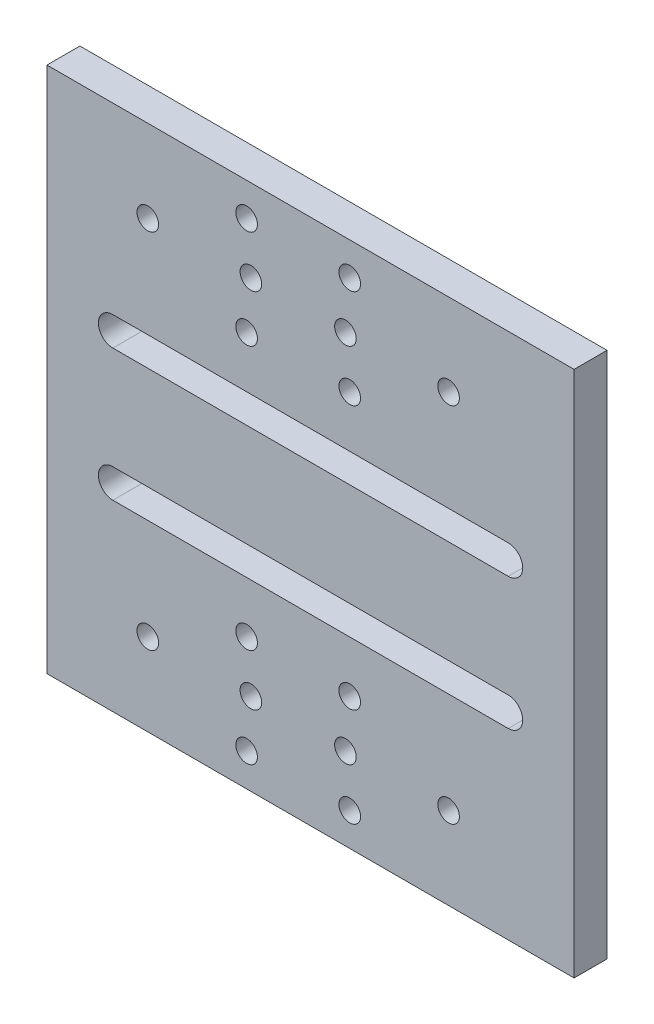
ISO-10303-21;
HEADER;
FILE_DESCRIPTION(('STEP AP214'),'2;1');
FILE_NAME('part.step','',(''),(''),'','','');
FILE_SCHEMA(('AUTOMOTIVE_DESIGN { 1 0 10303 214 1 1 1 1 }'));
ENDSEC;
DATA;
#1=APPLICATION_CONTEXT('core data for automotive mechanical design processes');
#2=APPLICATION_PROTOCOL_DEFINITION('international standard','automotive_design',2000,#1);
#3=PRODUCT_CONTEXT('',#1,'mechanical');
#4=PRODUCT('Part','Part','',(#3));
#5=PRODUCT_RELATED_PRODUCT_CATEGORY('part','',(#4));
#6=PRODUCT_DEFINITION_FORMATION('','',#4);
#7=PRODUCT_DEFINITION_CONTEXT('part definition',#1,'design');
#8=PRODUCT_DEFINITION('design','',#6,#7);
#9=PRODUCT_DEFINITION_SHAPE('','',#8);
#10=(LENGTH_UNIT() NAMED_UNIT(*) SI_UNIT(.MILLI.,.METRE.));
#11=(NAMED_UNIT(*) PLANE_ANGLE_UNIT() SI_UNIT($,.RADIAN.));
#12=(NAMED_UNIT(*) SI_UNIT($,.STERADIAN.) SOLID_ANGLE_UNIT());
#13=UNCERTAINTY_MEASURE_WITH_UNIT(LENGTH_MEASURE(1.E-05),#10,'distance_accuracy_value','');
#14=(GEOMETRIC_REPRESENTATION_CONTEXT(3) GLOBAL_UNCERTAINTY_ASSIGNED_CONTEXT((#13)) GLOBAL_UNIT_ASSIGNED_CONTEXT((#10,
#11,#12)) REPRESENTATION_CONTEXT('',''));
#15=CARTESIAN_POINT('',(0.,0.,0.));
#16=DIRECTION('',(0.,0.,1.));
#17=DIRECTION('',(1.,0.,0.));
#18=AXIS2_PLACEMENT_3D('',#15,#16,#17);
#19=CARTESIAN_POINT('',(0.,101.6,0.));
#20=DIRECTION('',(1.,0.,0.));
#21=DIRECTION('',(0.,0.,-1.));
#22=AXIS2_PLACEMENT_3D('',#19,#20,#21);
#23=PLANE('',#22);
#24=DIRECTION('',(0.,0.,1.));
#25=VECTOR('',#24,1.);
#26=CARTESIAN_POINT('',(0.,0.,0.));
#27=LINE('',#26,#25);
#28=CARTESIAN_POINT('',(0.,0.,-6.35));
#29=VERTEX_POINT('',#28);
#30=CARTESIAN_POINT('',(0.,0.,0.));
#31=VERTEX_POINT('',#30);
#32=EDGE_CURVE('E179',#29,#31,#27,.T.);
#33=ORIENTED_EDGE('',*,*,#32,.T.);
#34=DIRECTION('',(0.,-1.,0.));
#35=VECTOR('',#34,1.);
#36=CARTESIAN_POINT('',(0.,101.6,0.));
#37=LINE('',#36,#35);
#38=CARTESIAN_POINT('',(0.,101.6,0.));
#39=VERTEX_POINT('',#38);
#40=EDGE_CURVE('E11',#39,#31,#37,.T.);
#41=ORIENTED_EDGE('',*,*,#40,.F.);
#42=DIRECTION('',(0.,0.,1.));
#43=VECTOR('',#42,1.);
#44=CARTESIAN_POINT('',(0.,101.6,0.));
#45=LINE('',#44,#43);
#46=CARTESIAN_POINT('',(0.,101.6,-6.35));
#47=VERTEX_POINT('',#46);
#48=EDGE_CURVE('E227',#47,#39,#45,.T.);
#49=ORIENTED_EDGE('',*,*,#48,.F.);
#50=DIRECTION('',(0.,-1.,0.));
#51=VECTOR('',#50,1.);
#52=CARTESIAN_POINT('',(0.,101.6,-6.35));
#53=LINE('',#52,#51);
#54=EDGE_CURVE('E241',#47,#29,#53,.T.);
#55=ORIENTED_EDGE('',*,*,#54,.T.);
#56=EDGE_LOOP('',(#33,#41,#49,#55));
#57=FACE_BOUND('',#56,.T.);
#58=ADVANCED_FACE('F39',(#57),#23,.F.);
#59=CARTESIAN_POINT('',(0.,101.6,0.));
#60=DIRECTION('',(0.,0.,-1.));
#61=DIRECTION('',(-1.,0.,0.));
#62=AXIS2_PLACEMENT_3D('',#59,#60,#61);
#63=PLANE('',#62);
#64=CARTESIAN_POINT('',(77.4065,85.725,0.));
#65=DIRECTION('',(0.,0.,-1.));
#66=DIRECTION('',(-1.,0.,0.));
#67=AXIS2_PLACEMENT_3D('',#64,#65,#66);
#68=CIRCLE('',#67,2.08279999999998);
#69=CARTESIAN_POINT('',(75.3237,85.725,0.));
#70=VERTEX_POINT('',#69);
#71=EDGE_CURVE('E394',#70,#70,#68,.T.);
#72=ORIENTED_EDGE('',*,*,#71,.T.);
#73=EDGE_LOOP('',(#72));
#74=FACE_BOUND('',#73,.T.);
#75=CARTESIAN_POINT('',(58.3565,95.25,0.));
#76=DIRECTION('',(0.,0.,-1.));
#77=DIRECTION('',(-1.,0.,0.));
#78=AXIS2_PLACEMENT_3D('',#75,#76,#77);
#79=CIRCLE('',#78,2.08279999999998);
#80=CARTESIAN_POINT('',(56.2737,95.25,0.));
#81=VERTEX_POINT('',#80);
#82=EDGE_CURVE('E403',#81,#81,#79,.T.);
#83=ORIENTED_EDGE('',*,*,#82,.T.);
#84=EDGE_LOOP('',(#83));
#85=FACE_BOUND('',#84,.T.);
#86=CARTESIAN_POINT('',(58.3565,76.2,0.));
#87=DIRECTION('',(0.,0.,-1.));
#88=DIRECTION('',(-1.,0.,0.));
#89=AXIS2_PLACEMENT_3D('',#86,#87,#88);
#90=CIRCLE('',#89,2.08279999999998);
#91=CARTESIAN_POINT('',(56.2737,76.2,0.));
#92=VERTEX_POINT('',#91);
#93=EDGE_CURVE('E413',#92,#92,#90,.T.);
#94=ORIENTED_EDGE('',*,*,#93,.T.);
#95=EDGE_LOOP('',(#94));
#96=FACE_BOUND('',#95,.T.);
#97=CARTESIAN_POINT('',(39.3065,85.725,0.));
#98=DIRECTION('',(0.,0.,-1.));
#99=DIRECTION('',(-1.,0.,0.));
#100=AXIS2_PLACEMENT_3D('',#97,#98,#99);
#101=CIRCLE('',#100,2.08279999999999);
#102=CARTESIAN_POINT('',(37.2237,85.725,0.));
#103=VERTEX_POINT('',#102);
#104=EDGE_CURVE('E421',#103,#103,#101,.T.);
#105=ORIENTED_EDGE('',*,*,#104,.T.);
#106=EDGE_LOOP('',(#105));
#107=FACE_BOUND('',#106,.T.);
#108=CARTESIAN_POINT('',(77.4065,15.875,0.));
#109=DIRECTION('',(0.,0.,1.));
#110=DIRECTION('',(-1.,0.,0.));
#111=AXIS2_PLACEMENT_3D('',#108,#109,#110);
#112=CIRCLE('',#111,2.08279999999998);
#113=CARTESIAN_POINT('',(75.3237,15.875,0.));
#114=VERTEX_POINT('',#113);
#115=EDGE_CURVE('E430',#114,#114,#112,.T.);
#116=ORIENTED_EDGE('',*,*,#115,.F.);
#117=EDGE_LOOP('',(#116));
#118=FACE_BOUND('',#117,.T.);
#119=CARTESIAN_POINT('',(58.3565,6.34999999999999,0.));
#120=DIRECTION('',(0.,0.,1.));
#121=DIRECTION('',(-1.,0.,0.));
#122=AXIS2_PLACEMENT_3D('',#119,#120,#121);
#123=CIRCLE('',#122,2.08279999999998);
#124=CARTESIAN_POINT('',(56.2737,6.34999999999999,0.));
#125=VERTEX_POINT('',#124);
#126=EDGE_CURVE('E438',#125,#125,#123,.T.);
#127=ORIENTED_EDGE('',*,*,#126,.F.);
#128=EDGE_LOOP('',(#127));
#129=FACE_BOUND('',#128,.T.);
#130=CARTESIAN_POINT('',(58.3565,25.4,0.));
#131=DIRECTION('',(0.,0.,1.));
#132=DIRECTION('',(-1.,0.,0.));
#133=AXIS2_PLACEMENT_3D('',#130,#131,#132);
#134=CIRCLE('',#133,2.08279999999998);
#135=CARTESIAN_POINT('',(56.2737,25.4,0.));
#136=VERTEX_POINT('',#135);
#137=EDGE_CURVE('E446',#136,#136,#134,.T.);
#138=ORIENTED_EDGE('',*,*,#137,.F.);
#139=EDGE_LOOP('',(#138));
#140=FACE_BOUND('',#139,.T.);
#141=CARTESIAN_POINT('',(39.3065,15.875,0.));
#142=DIRECTION('',(0.,0.,1.));
#143=DIRECTION('',(-1.,0.,0.));
#144=AXIS2_PLACEMENT_3D('',#141,#142,#143);
#145=CIRCLE('',#144,2.08279999999999);
#146=CARTESIAN_POINT('',(37.2237,15.875,0.));
#147=VERTEX_POINT('',#146);
#148=EDGE_CURVE('E400',#147,#147,#145,.T.);
#149=ORIENTED_EDGE('',*,*,#148,.F.);
#150=EDGE_LOOP('',(#149));
#151=FACE_BOUND('',#150,.T.);
#152=CARTESIAN_POINT('',(19.431,15.875,0.));
#153=DIRECTION('',(0.,0.,-1.));
#154=DIRECTION('',(1.,0.,0.));
#155=AXIS2_PLACEMENT_3D('',#152,#153,#154);
#156=CIRCLE('',#155,2.08279999999998);
#157=CARTESIAN_POINT('',(21.5138,15.875,0.));
#158=VERTEX_POINT('',#157);
#159=EDGE_CURVE('E461',#158,#158,#156,.T.);
#160=ORIENTED_EDGE('',*,*,#159,.T.);
#161=EDGE_LOOP('',(#160));
#162=FACE_BOUND('',#161,.T.);
#163=CARTESIAN_POINT('',(38.481,6.34999999999999,0.));
#164=DIRECTION('',(0.,0.,-1.));
#165=DIRECTION('',(1.,0.,0.));
#166=AXIS2_PLACEMENT_3D('',#163,#164,#165);
#167=CIRCLE('',#166,2.08279999999998);
#168=CARTESIAN_POINT('',(40.5638,6.34999999999999,0.));
#169=VERTEX_POINT('',#168);
#170=EDGE_CURVE('E469',#169,#169,#167,.T.);
#171=ORIENTED_EDGE('',*,*,#170,.T.);
#172=EDGE_LOOP('',(#171));
#173=FACE_BOUND('',#172,.T.);
#174=CARTESIAN_POINT('',(38.481,25.4,0.));
#175=DIRECTION('',(0.,0.,-1.));
#176=DIRECTION('',(1.,0.,0.));
#177=AXIS2_PLACEMENT_3D('',#174,#175,#176);
#178=CIRCLE('',#177,2.08279999999998);
#179=CARTESIAN_POINT('',(40.5638,25.4,0.));
#180=VERTEX_POINT('',#179);
#181=EDGE_CURVE('E477',#180,#180,#178,.T.);
#182=ORIENTED_EDGE('',*,*,#181,.T.);
#183=EDGE_LOOP('',(#182));
#184=FACE_BOUND('',#183,.T.);
#185=CARTESIAN_POINT('',(57.531,15.875,0.));
#186=DIRECTION('',(0.,0.,-1.));
#187=DIRECTION('',(1.,0.,0.));
#188=AXIS2_PLACEMENT_3D('',#185,#186,#187);
#189=CIRCLE('',#188,2.08279999999999);
#190=CARTESIAN_POINT('',(59.6138,15.875,0.));
#191=VERTEX_POINT('',#190);
#192=EDGE_CURVE('E429',#191,#191,#189,.T.);
#193=ORIENTED_EDGE('',*,*,#192,.T.);
#194=EDGE_LOOP('',(#193));
#195=FACE_BOUND('',#194,.T.);
#196=CARTESIAN_POINT('',(19.431,85.725,0.));
#197=DIRECTION('',(0.,0.,1.));
#198=DIRECTION('',(1.,0.,0.));
#199=AXIS2_PLACEMENT_3D('',#196,#197,#198);
#200=CIRCLE('',#199,2.08279999999998);
#201=CARTESIAN_POINT('',(21.5138,85.725,0.));
#202=VERTEX_POINT('',#201);
#203=EDGE_CURVE('E491',#202,#202,#200,.T.);
#204=ORIENTED_EDGE('',*,*,#203,.F.);
#205=EDGE_LOOP('',(#204));
#206=FACE_BOUND('',#205,.T.);
#207=CARTESIAN_POINT('',(38.481,95.25,0.));
#208=DIRECTION('',(0.,0.,1.));
#209=DIRECTION('',(1.,0.,0.));
#210=AXIS2_PLACEMENT_3D('',#207,#208,#209);
#211=CIRCLE('',#210,2.08279999999998);
#212=CARTESIAN_POINT('',(40.5638,95.25,0.));
#213=VERTEX_POINT('',#212);
#214=EDGE_CURVE('E499',#213,#213,#211,.T.);
#215=ORIENTED_EDGE('',*,*,#214,.F.);
#216=EDGE_LOOP('',(#215));
#217=FACE_BOUND('',#216,.T.);
#218=CARTESIAN_POINT('',(38.481,76.2,0.));
#219=DIRECTION('',(0.,0.,1.));
#220=DIRECTION('',(1.,0.,0.));
#221=AXIS2_PLACEMENT_3D('',#218,#219,#220);
#222=CIRCLE('',#221,2.08279999999998);
#223=CARTESIAN_POINT('',(40.5638,76.2,0.));
#224=VERTEX_POINT('',#223);
#225=EDGE_CURVE('E507',#224,#224,#222,.T.);
#226=ORIENTED_EDGE('',*,*,#225,.F.);
#227=EDGE_LOOP('',(#226));
#228=FACE_BOUND('',#227,.T.);
#229=CARTESIAN_POINT('',(57.531,85.725,0.));
#230=DIRECTION('',(0.,0.,1.));
#231=DIRECTION('',(1.,0.,0.));
#232=AXIS2_PLACEMENT_3D('',#229,#230,#231);
#233=CIRCLE('',#232,2.08279999999999);
#234=CARTESIAN_POINT('',(59.6138,85.725,0.));
#235=VERTEX_POINT('',#234);
#236=EDGE_CURVE('E160',#235,#235,#233,.T.);
#237=ORIENTED_EDGE('',*,*,#236,.F.);
#238=EDGE_LOOP('',(#237));
#239=FACE_BOUND('',#238,.T.);
#240=DIRECTION('',(1.,0.,0.));
#241=VECTOR('',#240,1.);
#242=CARTESIAN_POINT('',(88.9,66.294,0.));
#243=LINE('',#242,#241);
#244=CARTESIAN_POINT('',(12.7,66.294,0.));
#245=VERTEX_POINT('',#244);
#246=CARTESIAN_POINT('',(88.9,66.294,0.));
#247=VERTEX_POINT('',#246);
#248=EDGE_CURVE('E141',#245,#247,#243,.T.);
#249=ORIENTED_EDGE('',*,*,#248,.T.);
#250=CARTESIAN_POINT('',(88.9,63.5,0.));
#251=DIRECTION('',(0.,0.,-1.));
#252=DIRECTION('',(-1.,0.,0.));
#253=AXIS2_PLACEMENT_3D('',#250,#251,#252);
#254=CIRCLE('',#253,2.794);
#255=CARTESIAN_POINT('',(88.9,60.706,0.));
#256=VERTEX_POINT('',#255);
#257=EDGE_CURVE('E132',#247,#256,#254,.T.);
#258=ORIENTED_EDGE('',*,*,#257,.T.);
#259=DIRECTION('',(-1.,0.,0.));
#260=VECTOR('',#259,1.);
#261=CARTESIAN_POINT('',(88.9,60.706,0.));
#262=LINE('',#261,#260);
#263=CARTESIAN_POINT('',(12.7,60.706,0.));
#264=VERTEX_POINT('',#263);
#265=EDGE_CURVE('E144',#256,#264,#262,.T.);
#266=ORIENTED_EDGE('',*,*,#265,.T.);
#267=CARTESIAN_POINT('',(12.7,63.5,0.));
#268=DIRECTION('',(0.,0.,-1.));
#269=DIRECTION('',(1.,0.,0.));
#270=AXIS2_PLACEMENT_3D('',#267,#268,#269);
#271=CIRCLE('',#270,2.794);
#272=EDGE_CURVE('E54',#264,#245,#271,.T.);
#273=ORIENTED_EDGE('',*,*,#272,.T.);
#274=EDGE_LOOP('',(#249,#258,#266,#273));
#275=FACE_BOUND('',#274,.T.);
#276=DIRECTION('',(-1.,0.,0.));
#277=VECTOR('',#276,1.);
#278=CARTESIAN_POINT('',(88.9,35.306,0.));
#279=LINE('',#278,#277);
#280=CARTESIAN_POINT('',(88.9,35.306,0.));
#281=VERTEX_POINT('',#280);
#282=CARTESIAN_POINT('',(12.7,35.306,0.));
#283=VERTEX_POINT('',#282);
#284=EDGE_CURVE('E196',#281,#283,#279,.T.);
#285=ORIENTED_EDGE('',*,*,#284,.T.);
#286=CARTESIAN_POINT('',(12.7,38.1,0.));
#287=DIRECTION('',(0.,0.,-1.));
#288=DIRECTION('',(-1.,0.,0.));
#289=AXIS2_PLACEMENT_3D('',#286,#287,#288);
#290=CIRCLE('',#289,2.794);
#291=CARTESIAN_POINT('',(12.7,40.894,0.));
#292=VERTEX_POINT('',#291);
#293=EDGE_CURVE('E185',#283,#292,#290,.T.);
#294=ORIENTED_EDGE('',*,*,#293,.T.);
#295=DIRECTION('',(1.,0.,0.));
#296=VECTOR('',#295,1.);
#297=CARTESIAN_POINT('',(88.9,40.894,0.));
#298=LINE('',#297,#296);
#299=CARTESIAN_POINT('',(88.9,40.894,0.));
#300=VERTEX_POINT('',#299);
#301=EDGE_CURVE('E189',#292,#300,#298,.T.);
#302=ORIENTED_EDGE('',*,*,#301,.T.);
#303=CARTESIAN_POINT('',(88.9,38.1,0.));
#304=DIRECTION('',(0.,0.,-1.));
#305=DIRECTION('',(1.,0.,0.));
#306=AXIS2_PLACEMENT_3D('',#303,#304,#305);
#307=CIRCLE('',#306,2.794);
#308=EDGE_CURVE('E62',#300,#281,#307,.T.);
#309=ORIENTED_EDGE('',*,*,#308,.T.);
#310=EDGE_LOOP('',(#285,#294,#302,#309));
#311=FACE_BOUND('',#310,.T.);
#312=DIRECTION('',(1.,0.,0.));
#313=VECTOR('',#312,1.);
#314=CARTESIAN_POINT('',(0.,0.,0.));
#315=LINE('',#314,#313);
#316=CARTESIAN_POINT('',(101.6,0.,0.));
#317=VERTEX_POINT('',#316);
#318=EDGE_CURVE('E245',#31,#317,#315,.T.);
#319=ORIENTED_EDGE('',*,*,#318,.T.);
#320=DIRECTION('',(0.,-1.,0.));
#321=VECTOR('',#320,1.);
#322=CARTESIAN_POINT('',(101.6,101.6,0.));
#323=LINE('',#322,#321);
#324=CARTESIAN_POINT('',(101.6,101.6,0.));
#325=VERTEX_POINT('',#324);
#326=EDGE_CURVE('E47',#325,#317,#323,.T.);
#327=ORIENTED_EDGE('',*,*,#326,.F.);
#328=DIRECTION('',(1.,0.,0.));
#329=VECTOR('',#328,1.);
#330=CARTESIAN_POINT('',(0.,101.6,0.));
#331=LINE('',#330,#329);
#332=EDGE_CURVE('E231',#39,#325,#331,.T.);
#333=ORIENTED_EDGE('',*,*,#332,.F.);
#334=ORIENTED_EDGE('',*,*,#40,.T.);
#335=EDGE_LOOP('',(#319,#327,#333,#334));
#336=FACE_BOUND('',#335,.T.);
#337=ADVANCED_FACE('F149',(#74,#85,#96,#107,#118,#129,#140,#151,#162,#173,#184,#195,#206,#217,
#228,#239,#275,#311,#336),#63,.F.);
#338=CARTESIAN_POINT('',(101.6,101.6,0.));
#339=DIRECTION('',(-1.,0.,0.));
#340=DIRECTION('',(0.,0.,1.));
#341=AXIS2_PLACEMENT_3D('',#338,#339,#340);
#342=PLANE('',#341);
#343=DIRECTION('',(0.,0.,-1.));
#344=VECTOR('',#343,1.);
#345=CARTESIAN_POINT('',(101.6,0.,0.));
#346=LINE('',#345,#344);
#347=CARTESIAN_POINT('',(101.6,0.,-6.35));
#348=VERTEX_POINT('',#347);
#349=EDGE_CURVE('E248',#317,#348,#346,.T.);
#350=ORIENTED_EDGE('',*,*,#349,.T.);
#351=DIRECTION('',(0.,-1.,0.));
#352=VECTOR('',#351,1.);
#353=CARTESIAN_POINT('',(101.6,101.6,-6.35));
#354=LINE('',#353,#352);
#355=CARTESIAN_POINT('',(101.6,101.6,-6.35));
#356=VERTEX_POINT('',#355);
#357=EDGE_CURVE('E256',#356,#348,#354,.T.);
#358=ORIENTED_EDGE('',*,*,#357,.F.);
#359=DIRECTION('',(0.,0.,-1.));
#360=VECTOR('',#359,1.);
#361=CARTESIAN_POINT('',(101.6,101.6,0.));
#362=LINE('',#361,#360);
#363=EDGE_CURVE('E235',#325,#356,#362,.T.);
#364=ORIENTED_EDGE('',*,*,#363,.F.);
#365=ORIENTED_EDGE('',*,*,#326,.T.);
#366=EDGE_LOOP('',(#350,#358,#364,#365));
#367=FACE_BOUND('',#366,.T.);
#368=ADVANCED_FACE('F265',(#367),#342,.F.);
#369=CARTESIAN_POINT('',(0.,101.6,-6.35));
#370=DIRECTION('',(0.,0.,1.));
#371=DIRECTION('',(1.,0.,0.));
#372=AXIS2_PLACEMENT_3D('',#369,#370,#371);
#373=PLANE('',#372);
#374=CARTESIAN_POINT('',(77.4065,85.725,-6.35));
#375=DIRECTION('',(0.,0.,-1.));
#376=DIRECTION('',(-1.,0.,0.));
#377=AXIS2_PLACEMENT_3D('',#374,#375,#376);
#378=CIRCLE('',#377,2.08279999999998);
#379=CARTESIAN_POINT('',(75.3237,85.725,-6.35));
#380=VERTEX_POINT('',#379);
#381=EDGE_CURVE('E392',#380,#380,#378,.T.);
#382=ORIENTED_EDGE('',*,*,#381,.F.);
#383=EDGE_LOOP('',(#382));
#384=FACE_BOUND('',#383,.T.);
#385=CARTESIAN_POINT('',(58.3565,95.25,-6.35));
#386=DIRECTION('',(0.,0.,-1.));
#387=DIRECTION('',(-1.,0.,0.));
#388=AXIS2_PLACEMENT_3D('',#385,#386,#387);
#389=CIRCLE('',#388,2.08279999999998);
#390=CARTESIAN_POINT('',(56.2737,95.25,-6.35));
#391=VERTEX_POINT('',#390);
#392=EDGE_CURVE('E396',#391,#391,#389,.T.);
#393=ORIENTED_EDGE('',*,*,#392,.F.);
#394=EDGE_LOOP('',(#393));
#395=FACE_BOUND('',#394,.T.);
#396=CARTESIAN_POINT('',(58.3565,76.2,-6.35));
#397=DIRECTION('',(0.,0.,-1.));
#398=DIRECTION('',(-1.,0.,0.));
#399=AXIS2_PLACEMENT_3D('',#396,#397,#398);
#400=CIRCLE('',#399,2.08279999999998);
#401=CARTESIAN_POINT('',(56.2737,76.2,-6.35));
#402=VERTEX_POINT('',#401);
#403=EDGE_CURVE('E409',#402,#402,#400,.T.);
#404=ORIENTED_EDGE('',*,*,#403,.F.);
#405=EDGE_LOOP('',(#404));
#406=FACE_BOUND('',#405,.T.);
#407=CARTESIAN_POINT('',(39.3065,85.725,-6.35));
#408=DIRECTION('',(0.,0.,-1.));
#409=DIRECTION('',(-1.,0.,0.));
#410=AXIS2_PLACEMENT_3D('',#407,#408,#409);
#411=CIRCLE('',#410,2.08279999999999);
#412=CARTESIAN_POINT('',(37.2237,85.725,-6.35));
#413=VERTEX_POINT('',#412);
#414=EDGE_CURVE('E417',#413,#413,#411,.T.);
#415=ORIENTED_EDGE('',*,*,#414,.F.);
#416=EDGE_LOOP('',(#415));
#417=FACE_BOUND('',#416,.T.);
#418=CARTESIAN_POINT('',(77.4065,15.875,-6.35));
#419=DIRECTION('',(0.,0.,1.));
#420=DIRECTION('',(-1.,0.,0.));
#421=AXIS2_PLACEMENT_3D('',#418,#419,#420);
#422=CIRCLE('',#421,2.08279999999998);
#423=CARTESIAN_POINT('',(75.3237,15.875,-6.35));
#424=VERTEX_POINT('',#423);
#425=EDGE_CURVE('E425',#424,#424,#422,.T.);
#426=ORIENTED_EDGE('',*,*,#425,.T.);
#427=EDGE_LOOP('',(#426));
#428=FACE_BOUND('',#427,.T.);
#429=CARTESIAN_POINT('',(58.3565,6.34999999999999,-6.35));
#430=DIRECTION('',(0.,0.,1.));
#431=DIRECTION('',(-1.,0.,0.));
#432=AXIS2_PLACEMENT_3D('',#429,#430,#431);
#433=CIRCLE('',#432,2.08279999999998);
#434=CARTESIAN_POINT('',(56.2737,6.34999999999999,-6.35));
#435=VERTEX_POINT('',#434);
#436=EDGE_CURVE('E434',#435,#435,#433,.T.);
#437=ORIENTED_EDGE('',*,*,#436,.T.);
#438=EDGE_LOOP('',(#437));
#439=FACE_BOUND('',#438,.T.);
#440=CARTESIAN_POINT('',(58.3565,25.4,-6.35));
#441=DIRECTION('',(0.,0.,1.));
#442=DIRECTION('',(-1.,0.,0.));
#443=AXIS2_PLACEMENT_3D('',#440,#441,#442);
#444=CIRCLE('',#443,2.08279999999998);
#445=CARTESIAN_POINT('',(56.2737,25.4,-6.35));
#446=VERTEX_POINT('',#445);
#447=EDGE_CURVE('E442',#446,#446,#444,.T.);
#448=ORIENTED_EDGE('',*,*,#447,.T.);
#449=EDGE_LOOP('',(#448));
#450=FACE_BOUND('',#449,.T.);
#451=CARTESIAN_POINT('',(39.3065,15.875,-6.35));
#452=DIRECTION('',(0.,0.,1.));
#453=DIRECTION('',(-1.,0.,0.));
#454=AXIS2_PLACEMENT_3D('',#451,#452,#453);
#455=CIRCLE('',#454,2.08279999999999);
#456=CARTESIAN_POINT('',(37.2237,15.875,-6.35));
#457=VERTEX_POINT('',#456);
#458=EDGE_CURVE('E450',#457,#457,#455,.T.);
#459=ORIENTED_EDGE('',*,*,#458,.T.);
#460=EDGE_LOOP('',(#459));
#461=FACE_BOUND('',#460,.T.);
#462=CARTESIAN_POINT('',(19.431,15.875,-6.35));
#463=DIRECTION('',(0.,0.,-1.));
#464=DIRECTION('',(1.,0.,0.));
#465=AXIS2_PLACEMENT_3D('',#462,#463,#464);
#466=CIRCLE('',#465,2.08279999999998);
#467=CARTESIAN_POINT('',(21.5138,15.875,-6.35));
#468=VERTEX_POINT('',#467);
#469=EDGE_CURVE('E457',#468,#468,#466,.T.);
#470=ORIENTED_EDGE('',*,*,#469,.F.);
#471=EDGE_LOOP('',(#470));
#472=FACE_BOUND('',#471,.T.);
#473=CARTESIAN_POINT('',(38.481,6.34999999999999,-6.35));
#474=DIRECTION('',(0.,0.,-1.));
#475=DIRECTION('',(1.,0.,0.));
#476=AXIS2_PLACEMENT_3D('',#473,#474,#475);
#477=CIRCLE('',#476,2.08279999999998);
#478=CARTESIAN_POINT('',(40.5638,6.34999999999999,-6.35));
#479=VERTEX_POINT('',#478);
#480=EDGE_CURVE('E465',#479,#479,#477,.T.);
#481=ORIENTED_EDGE('',*,*,#480,.F.);
#482=EDGE_LOOP('',(#481));
#483=FACE_BOUND('',#482,.T.);
#484=CARTESIAN_POINT('',(38.481,25.4,-6.35));
#485=DIRECTION('',(0.,0.,-1.));
#486=DIRECTION('',(1.,0.,0.));
#487=AXIS2_PLACEMENT_3D('',#484,#485,#486);
#488=CIRCLE('',#487,2.08279999999998);
#489=CARTESIAN_POINT('',(40.5638,25.4,-6.35));
#490=VERTEX_POINT('',#489);
#491=EDGE_CURVE('E473',#490,#490,#488,.T.);
#492=ORIENTED_EDGE('',*,*,#491,.F.);
#493=EDGE_LOOP('',(#492));
#494=FACE_BOUND('',#493,.T.);
#495=CARTESIAN_POINT('',(57.531,15.875,-6.35));
#496=DIRECTION('',(0.,0.,-1.));
#497=DIRECTION('',(1.,0.,0.));
#498=AXIS2_PLACEMENT_3D('',#495,#496,#497);
#499=CIRCLE('',#498,2.08279999999999);
#500=CARTESIAN_POINT('',(59.6138,15.875,-6.35));
#501=VERTEX_POINT('',#500);
#502=EDGE_CURVE('E481',#501,#501,#499,.T.);
#503=ORIENTED_EDGE('',*,*,#502,.F.);
#504=EDGE_LOOP('',(#503));
#505=FACE_BOUND('',#504,.T.);
#506=CARTESIAN_POINT('',(19.431,85.725,-6.35));
#507=DIRECTION('',(0.,0.,1.));
#508=DIRECTION('',(1.,0.,0.));
#509=AXIS2_PLACEMENT_3D('',#506,#507,#508);
#510=CIRCLE('',#509,2.08279999999998);
#511=CARTESIAN_POINT('',(21.5138,85.725,-6.35));
#512=VERTEX_POINT('',#511);
#513=EDGE_CURVE('E205',#512,#512,#510,.T.);
#514=ORIENTED_EDGE('',*,*,#513,.T.);
#515=EDGE_LOOP('',(#514));
#516=FACE_BOUND('',#515,.T.);
#517=CARTESIAN_POINT('',(38.481,95.25,-6.35));
#518=DIRECTION('',(0.,0.,1.));
#519=DIRECTION('',(1.,0.,0.));
#520=AXIS2_PLACEMENT_3D('',#517,#518,#519);
#521=CIRCLE('',#520,2.08279999999998);
#522=CARTESIAN_POINT('',(40.5638,95.25,-6.35));
#523=VERTEX_POINT('',#522);
#524=EDGE_CURVE('E495',#523,#523,#521,.T.);
#525=ORIENTED_EDGE('',*,*,#524,.T.);
#526=EDGE_LOOP('',(#525));
#527=FACE_BOUND('',#526,.T.);
#528=CARTESIAN_POINT('',(38.481,76.2,-6.35));
#529=DIRECTION('',(0.,0.,1.));
#530=DIRECTION('',(1.,0.,0.));
#531=AXIS2_PLACEMENT_3D('',#528,#529,#530);
#532=CIRCLE('',#531,2.08279999999998);
#533=CARTESIAN_POINT('',(40.5638,76.2,-6.35));
#534=VERTEX_POINT('',#533);
#535=EDGE_CURVE('E503',#534,#534,#532,.T.);
#536=ORIENTED_EDGE('',*,*,#535,.T.);
#537=EDGE_LOOP('',(#536));
#538=FACE_BOUND('',#537,.T.);
#539=CARTESIAN_POINT('',(57.531,85.725,-6.35));
#540=DIRECTION('',(0.,0.,1.));
#541=DIRECTION('',(1.,0.,0.));
#542=AXIS2_PLACEMENT_3D('',#539,#540,#541);
#543=CIRCLE('',#542,2.08279999999999);
#544=CARTESIAN_POINT('',(59.6138,85.725,-6.35));
#545=VERTEX_POINT('',#544);
#546=EDGE_CURVE('E510',#545,#545,#543,.T.);
#547=ORIENTED_EDGE('',*,*,#546,.T.);
#548=EDGE_LOOP('',(#547));
#549=FACE_BOUND('',#548,.T.);
#550=DIRECTION('',(-1.,0.,0.));
#551=VECTOR('',#550,1.);
#552=CARTESIAN_POINT('',(88.9,60.706,-6.35));
#553=LINE('',#552,#551);
#554=CARTESIAN_POINT('',(88.9,60.706,-6.35));
#555=VERTEX_POINT('',#554);
#556=CARTESIAN_POINT('',(12.7,60.706,-6.35));
#557=VERTEX_POINT('',#556);
#558=EDGE_CURVE('E169',#555,#557,#553,.T.);
#559=ORIENTED_EDGE('',*,*,#558,.F.);
#560=CARTESIAN_POINT('',(88.9,63.5,-6.35));
#561=DIRECTION('',(0.,0.,-1.));
#562=DIRECTION('',(-1.,0.,0.));
#563=AXIS2_PLACEMENT_3D('',#560,#561,#562);
#564=CIRCLE('',#563,2.794);
#565=CARTESIAN_POINT('',(88.9,66.294,-6.35));
#566=VERTEX_POINT('',#565);
#567=EDGE_CURVE('E135',#566,#555,#564,.T.);
#568=ORIENTED_EDGE('',*,*,#567,.F.);
#569=DIRECTION('',(1.,0.,0.));
#570=VECTOR('',#569,1.);
#571=CARTESIAN_POINT('',(88.9,66.294,-6.35));
#572=LINE('',#571,#570);
#573=CARTESIAN_POINT('',(12.7,66.294,-6.35));
#574=VERTEX_POINT('',#573);
#575=EDGE_CURVE('E153',#574,#566,#572,.T.);
#576=ORIENTED_EDGE('',*,*,#575,.F.);
#577=CARTESIAN_POINT('',(12.7,63.5,-6.35));
#578=DIRECTION('',(0.,0.,-1.));
#579=DIRECTION('',(1.,0.,0.));
#580=AXIS2_PLACEMENT_3D('',#577,#578,#579);
#581=CIRCLE('',#580,2.794);
#582=EDGE_CURVE('E157',#557,#574,#581,.T.);
#583=ORIENTED_EDGE('',*,*,#582,.F.);
#584=EDGE_LOOP('',(#559,#568,#576,#583));
#585=FACE_BOUND('',#584,.T.);
#586=DIRECTION('',(1.,0.,0.));
#587=VECTOR('',#586,1.);
#588=CARTESIAN_POINT('',(88.9,40.894,-6.35));
#589=LINE('',#588,#587);
#590=CARTESIAN_POINT('',(12.7,40.894,-6.35));
#591=VERTEX_POINT('',#590);
#592=CARTESIAN_POINT('',(88.9,40.894,-6.35));
#593=VERTEX_POINT('',#592);
#594=EDGE_CURVE('E204',#591,#593,#589,.T.);
#595=ORIENTED_EDGE('',*,*,#594,.F.);
#596=CARTESIAN_POINT('',(12.7,38.1,-6.35));
#597=DIRECTION('',(0.,0.,-1.));
#598=DIRECTION('',(-1.,0.,0.));
#599=AXIS2_PLACEMENT_3D('',#596,#597,#598);
#600=CIRCLE('',#599,2.794);
#601=CARTESIAN_POINT('',(12.7,35.306,-6.35));
#602=VERTEX_POINT('',#601);
#603=EDGE_CURVE('E201',#602,#591,#600,.T.);
#604=ORIENTED_EDGE('',*,*,#603,.F.);
#605=DIRECTION('',(-1.,0.,0.));
#606=VECTOR('',#605,1.);
#607=CARTESIAN_POINT('',(88.9,35.306,-6.35));
#608=LINE('',#607,#606);
#609=CARTESIAN_POINT('',(88.9,35.306,-6.35));
#610=VERTEX_POINT('',#609);
#611=EDGE_CURVE('E190',#610,#602,#608,.T.);
#612=ORIENTED_EDGE('',*,*,#611,.F.);
#613=CARTESIAN_POINT('',(88.9,38.1,-6.35));
#614=DIRECTION('',(0.,0.,-1.));
#615=DIRECTION('',(1.,0.,0.));
#616=AXIS2_PLACEMENT_3D('',#613,#614,#615);
#617=CIRCLE('',#616,2.794);
#618=EDGE_CURVE('E209',#593,#610,#617,.T.);
#619=ORIENTED_EDGE('',*,*,#618,.F.);
#620=EDGE_LOOP('',(#595,#604,#612,#619));
#621=FACE_BOUND('',#620,.T.);
#622=DIRECTION('',(-1.,0.,0.));
#623=VECTOR('',#622,1.);
#624=CARTESIAN_POINT('',(0.,0.,-6.35));
#625=LINE('',#624,#623);
#626=EDGE_CURVE('E232',#348,#29,#625,.T.);
#627=ORIENTED_EDGE('',*,*,#626,.T.);
#628=ORIENTED_EDGE('',*,*,#54,.F.);
#629=DIRECTION('',(-1.,0.,0.));
#630=VECTOR('',#629,1.);
#631=CARTESIAN_POINT('',(0.,101.6,-6.35));
#632=LINE('',#631,#630);
#633=EDGE_CURVE('E238',#356,#47,#632,.T.);
#634=ORIENTED_EDGE('',*,*,#633,.F.);
#635=ORIENTED_EDGE('',*,*,#357,.T.);
#636=EDGE_LOOP('',(#627,#628,#634,#635));
#637=FACE_BOUND('',#636,.T.);
#638=ADVANCED_FACE('F274',(#384,#395,#406,#417,#428,#439,#450,#461,#472,#483,#494,#505,#516,
#527,#538,#549,#585,#621,#637),#373,.F.);
#639=CARTESIAN_POINT('',(0.,101.6,0.));
#640=DIRECTION('',(0.,-1.,0.));
#641=DIRECTION('',(0.,0.,-1.));
#642=AXIS2_PLACEMENT_3D('',#639,#640,#641);
#643=PLANE('',#642);
#644=ORIENTED_EDGE('',*,*,#48,.T.);
#645=ORIENTED_EDGE('',*,*,#332,.T.);
#646=ORIENTED_EDGE('',*,*,#363,.T.);
#647=ORIENTED_EDGE('',*,*,#633,.T.);
#648=EDGE_LOOP('',(#644,#645,#646,#647));
#649=FACE_BOUND('',#648,.T.);
#650=ADVANCED_FACE('F280',(#649),#643,.F.);
#651=CARTESIAN_POINT('',(0.,0.,0.));
#652=DIRECTION('',(0.,-1.,0.));
#653=DIRECTION('',(0.,0.,-1.));
#654=AXIS2_PLACEMENT_3D('',#651,#652,#653);
#655=PLANE('',#654);
#656=ORIENTED_EDGE('',*,*,#32,.F.);
#657=ORIENTED_EDGE('',*,*,#626,.F.);
#658=ORIENTED_EDGE('',*,*,#349,.F.);
#659=ORIENTED_EDGE('',*,*,#318,.F.);
#660=EDGE_LOOP('',(#656,#657,#658,#659));
#661=FACE_BOUND('',#660,.T.);
#662=ADVANCED_FACE('F271',(#661),#655,.T.);
#663=CARTESIAN_POINT('',(12.7,38.1,0.));
#664=DIRECTION('',(0.,0.,-1.));
#665=DIRECTION('',(-1.,0.,0.));
#666=AXIS2_PLACEMENT_3D('',#663,#664,#665);
#667=CYLINDRICAL_SURFACE('',#666,2.794);
#668=ORIENTED_EDGE('',*,*,#603,.T.);
#669=DIRECTION('',(0.,0.,-1.));
#670=VECTOR('',#669,1.);
#671=CARTESIAN_POINT('',(12.7,40.894,0.));
#672=LINE('',#671,#670);
#673=EDGE_CURVE('E200',#292,#591,#672,.T.);
#674=ORIENTED_EDGE('',*,*,#673,.F.);
#675=ORIENTED_EDGE('',*,*,#293,.F.);
#676=DIRECTION('',(0.,0.,-1.));
#677=VECTOR('',#676,1.);
#678=CARTESIAN_POINT('',(12.7,35.306,0.));
#679=LINE('',#678,#677);
#680=EDGE_CURVE('E170',#283,#602,#679,.T.);
#681=ORIENTED_EDGE('',*,*,#680,.T.);
#682=EDGE_LOOP('',(#668,#674,#675,#681));
#683=FACE_BOUND('',#682,.T.);
#684=ADVANCED_FACE('F296',(#683),#667,.F.);
#685=CARTESIAN_POINT('',(88.9,35.306,0.));
#686=DIRECTION('',(0.,-1.,0.));
#687=DIRECTION('',(0.,0.,-1.));
#688=AXIS2_PLACEMENT_3D('',#685,#686,#687);
#689=PLANE('',#688);
#690=ORIENTED_EDGE('',*,*,#611,.T.);
#691=ORIENTED_EDGE('',*,*,#680,.F.);
#692=ORIENTED_EDGE('',*,*,#284,.F.);
#693=DIRECTION('',(0.,0.,-1.));
#694=VECTOR('',#693,1.);
#695=CARTESIAN_POINT('',(88.9,35.306,0.));
#696=LINE('',#695,#694);
#697=EDGE_CURVE('E218',#281,#610,#696,.T.);
#698=ORIENTED_EDGE('',*,*,#697,.T.);
#699=EDGE_LOOP('',(#690,#691,#692,#698));
#700=FACE_BOUND('',#699,.T.);
#701=ADVANCED_FACE('F301',(#700),#689,.F.);
#702=CARTESIAN_POINT('',(88.9,38.1,0.));
#703=DIRECTION('',(0.,0.,-1.));
#704=DIRECTION('',(-1.,0.,0.));
#705=AXIS2_PLACEMENT_3D('',#702,#703,#704);
#706=CYLINDRICAL_SURFACE('',#705,2.794);
#707=ORIENTED_EDGE('',*,*,#618,.T.);
#708=ORIENTED_EDGE('',*,*,#697,.F.);
#709=ORIENTED_EDGE('',*,*,#308,.F.);
#710=DIRECTION('',(0.,0.,-1.));
#711=VECTOR('',#710,1.);
#712=CARTESIAN_POINT('',(88.9,40.894,0.));
#713=LINE('',#712,#711);
#714=EDGE_CURVE('E221',#300,#593,#713,.T.);
#715=ORIENTED_EDGE('',*,*,#714,.T.);
#716=EDGE_LOOP('',(#707,#708,#709,#715));
#717=FACE_BOUND('',#716,.T.);
#718=ADVANCED_FACE('F306',(#717),#706,.F.);
#719=CARTESIAN_POINT('',(88.9,40.894,0.));
#720=DIRECTION('',(0.,1.,0.));
#721=DIRECTION('',(0.,0.,1.));
#722=AXIS2_PLACEMENT_3D('',#719,#720,#721);
#723=PLANE('',#722);
#724=ORIENTED_EDGE('',*,*,#594,.T.);
#725=ORIENTED_EDGE('',*,*,#714,.F.);
#726=ORIENTED_EDGE('',*,*,#301,.F.);
#727=ORIENTED_EDGE('',*,*,#673,.T.);
#728=EDGE_LOOP('',(#724,#725,#726,#727));
#729=FACE_BOUND('',#728,.T.);
#730=ADVANCED_FACE('F303',(#729),#723,.F.);
#731=CARTESIAN_POINT('',(88.9,63.5,0.));
#732=DIRECTION('',(0.,0.,-1.));
#733=DIRECTION('',(-1.,0.,0.));
#734=AXIS2_PLACEMENT_3D('',#731,#732,#733);
#735=CYLINDRICAL_SURFACE('',#734,2.794);
#736=ORIENTED_EDGE('',*,*,#567,.T.);
#737=DIRECTION('',(0.,0.,-1.));
#738=VECTOR('',#737,1.);
#739=CARTESIAN_POINT('',(88.9,60.706,0.));
#740=LINE('',#739,#738);
#741=EDGE_CURVE('E128',#256,#555,#740,.T.);
#742=ORIENTED_EDGE('',*,*,#741,.F.);
#743=ORIENTED_EDGE('',*,*,#257,.F.);
#744=DIRECTION('',(0.,0.,-1.));
#745=VECTOR('',#744,1.);
#746=CARTESIAN_POINT('',(88.9,66.294,0.));
#747=LINE('',#746,#745);
#748=EDGE_CURVE('E176',#247,#566,#747,.T.);
#749=ORIENTED_EDGE('',*,*,#748,.T.);
#750=EDGE_LOOP('',(#736,#742,#743,#749));
#751=FACE_BOUND('',#750,.T.);
#752=ADVANCED_FACE('F130',(#751),#735,.F.);
#753=CARTESIAN_POINT('',(88.9,66.294,0.));
#754=DIRECTION('',(0.,1.,0.));
#755=DIRECTION('',(0.,0.,1.));
#756=AXIS2_PLACEMENT_3D('',#753,#754,#755);
#757=PLANE('',#756);
#758=ORIENTED_EDGE('',*,*,#575,.T.);
#759=ORIENTED_EDGE('',*,*,#748,.F.);
#760=ORIENTED_EDGE('',*,*,#248,.F.);
#761=DIRECTION('',(0.,0.,-1.));
#762=VECTOR('',#761,1.);
#763=CARTESIAN_POINT('',(12.7,66.294,0.));
#764=LINE('',#763,#762);
#765=EDGE_CURVE('E180',#245,#574,#764,.T.);
#766=ORIENTED_EDGE('',*,*,#765,.T.);
#767=EDGE_LOOP('',(#758,#759,#760,#766));
#768=FACE_BOUND('',#767,.T.);
#769=ADVANCED_FACE('F315',(#768),#757,.F.);
#770=CARTESIAN_POINT('',(12.7,63.5,0.));
#771=DIRECTION('',(0.,0.,-1.));
#772=DIRECTION('',(-1.,0.,0.));
#773=AXIS2_PLACEMENT_3D('',#770,#771,#772);
#774=CYLINDRICAL_SURFACE('',#773,2.794);
#775=ORIENTED_EDGE('',*,*,#582,.T.);
#776=ORIENTED_EDGE('',*,*,#765,.F.);
#777=ORIENTED_EDGE('',*,*,#272,.F.);
#778=DIRECTION('',(0.,0.,-1.));
#779=VECTOR('',#778,1.);
#780=CARTESIAN_POINT('',(12.7,60.706,0.));
#781=LINE('',#780,#779);
#782=EDGE_CURVE('E140',#264,#557,#781,.T.);
#783=ORIENTED_EDGE('',*,*,#782,.T.);
#784=EDGE_LOOP('',(#775,#776,#777,#783));
#785=FACE_BOUND('',#784,.T.);
#786=ADVANCED_FACE('F319',(#785),#774,.F.);
#787=CARTESIAN_POINT('',(88.9,60.706,0.));
#788=DIRECTION('',(0.,-1.,0.));
#789=DIRECTION('',(0.,0.,-1.));
#790=AXIS2_PLACEMENT_3D('',#787,#788,#789);
#791=PLANE('',#790);
#792=ORIENTED_EDGE('',*,*,#558,.T.);
#793=ORIENTED_EDGE('',*,*,#782,.F.);
#794=ORIENTED_EDGE('',*,*,#265,.F.);
#795=ORIENTED_EDGE('',*,*,#741,.T.);
#796=EDGE_LOOP('',(#792,#793,#794,#795));
#797=FACE_BOUND('',#796,.T.);
#798=ADVANCED_FACE('F145',(#797),#791,.F.);
#799=CARTESIAN_POINT('',(57.531,85.725,-6.35));
#800=DIRECTION('',(0.,0.,1.));
#801=DIRECTION('',(1.,0.,0.));
#802=AXIS2_PLACEMENT_3D('',#799,#800,#801);
#803=CYLINDRICAL_SURFACE('',#802,2.08279999999999);
#804=ORIENTED_EDGE('',*,*,#546,.F.);
#805=EDGE_LOOP('',(#804));
#806=FACE_BOUND('',#805,.T.);
#807=ORIENTED_EDGE('',*,*,#236,.T.);
#808=EDGE_LOOP('',(#807));
#809=FACE_BOUND('',#808,.T.);
#810=ADVANCED_FACE('F318',(#806,#809),#803,.F.);
#811=CARTESIAN_POINT('',(38.481,76.2,-6.35));
#812=DIRECTION('',(0.,0.,1.));
#813=DIRECTION('',(1.,0.,0.));
#814=AXIS2_PLACEMENT_3D('',#811,#812,#813);
#815=CYLINDRICAL_SURFACE('',#814,2.08279999999998);
#816=ORIENTED_EDGE('',*,*,#535,.F.);
#817=EDGE_LOOP('',(#816));
#818=FACE_BOUND('',#817,.T.);
#819=ORIENTED_EDGE('',*,*,#225,.T.);
#820=EDGE_LOOP('',(#819));
#821=FACE_BOUND('',#820,.T.);
#822=ADVANCED_FACE('F327',(#818,#821),#815,.F.);
#823=CARTESIAN_POINT('',(38.481,95.25,-6.35));
#824=DIRECTION('',(0.,0.,1.));
#825=DIRECTION('',(1.,0.,0.));
#826=AXIS2_PLACEMENT_3D('',#823,#824,#825);
#827=CYLINDRICAL_SURFACE('',#826,2.08279999999998);
#828=ORIENTED_EDGE('',*,*,#524,.F.);
#829=EDGE_LOOP('',(#828));
#830=FACE_BOUND('',#829,.T.);
#831=ORIENTED_EDGE('',*,*,#214,.T.);
#832=EDGE_LOOP('',(#831));
#833=FACE_BOUND('',#832,.T.);
#834=ADVANCED_FACE('F331',(#830,#833),#827,.F.);
#835=CARTESIAN_POINT('',(19.431,85.725,-6.35));
#836=DIRECTION('',(0.,0.,1.));
#837=DIRECTION('',(1.,0.,0.));
#838=AXIS2_PLACEMENT_3D('',#835,#836,#837);
#839=CYLINDRICAL_SURFACE('',#838,2.08279999999998);
#840=ORIENTED_EDGE('',*,*,#513,.F.);
#841=EDGE_LOOP('',(#840));
#842=FACE_BOUND('',#841,.T.);
#843=ORIENTED_EDGE('',*,*,#203,.T.);
#844=EDGE_LOOP('',(#843));
#845=FACE_BOUND('',#844,.T.);
#846=ADVANCED_FACE('F335',(#842,#845),#839,.F.);
#847=CARTESIAN_POINT('',(57.531,15.875,-6.35));
#848=DIRECTION('',(0.,0.,1.));
#849=DIRECTION('',(1.,0.,0.));
#850=AXIS2_PLACEMENT_3D('',#847,#848,#849);
#851=CYLINDRICAL_SURFACE('',#850,2.08279999999999);
#852=ORIENTED_EDGE('',*,*,#502,.T.);
#853=EDGE_LOOP('',(#852));
#854=FACE_BOUND('',#853,.T.);
#855=ORIENTED_EDGE('',*,*,#192,.F.);
#856=EDGE_LOOP('',(#855));
#857=FACE_BOUND('',#856,.T.);
#858=ADVANCED_FACE('F339',(#854,#857),#851,.F.);
#859=CARTESIAN_POINT('',(38.481,25.4,-6.35));
#860=DIRECTION('',(0.,0.,1.));
#861=DIRECTION('',(1.,0.,0.));
#862=AXIS2_PLACEMENT_3D('',#859,#860,#861);
#863=CYLINDRICAL_SURFACE('',#862,2.08279999999998);
#864=ORIENTED_EDGE('',*,*,#491,.T.);
#865=EDGE_LOOP('',(#864));
#866=FACE_BOUND('',#865,.T.);
#867=ORIENTED_EDGE('',*,*,#181,.F.);
#868=EDGE_LOOP('',(#867));
#869=FACE_BOUND('',#868,.T.);
#870=ADVANCED_FACE('F343',(#866,#869),#863,.F.);
#871=CARTESIAN_POINT('',(38.481,6.34999999999999,-6.35));
#872=DIRECTION('',(0.,0.,1.));
#873=DIRECTION('',(1.,0.,0.));
#874=AXIS2_PLACEMENT_3D('',#871,#872,#873);
#875=CYLINDRICAL_SURFACE('',#874,2.08279999999998);
#876=ORIENTED_EDGE('',*,*,#480,.T.);
#877=EDGE_LOOP('',(#876));
#878=FACE_BOUND('',#877,.T.);
#879=ORIENTED_EDGE('',*,*,#170,.F.);
#880=EDGE_LOOP('',(#879));
#881=FACE_BOUND('',#880,.T.);
#882=ADVANCED_FACE('F347',(#878,#881),#875,.F.);
#883=CARTESIAN_POINT('',(19.431,15.875,-6.35));
#884=DIRECTION('',(0.,0.,1.));
#885=DIRECTION('',(1.,0.,0.));
#886=AXIS2_PLACEMENT_3D('',#883,#884,#885);
#887=CYLINDRICAL_SURFACE('',#886,2.08279999999998);
#888=ORIENTED_EDGE('',*,*,#469,.T.);
#889=EDGE_LOOP('',(#888));
#890=FACE_BOUND('',#889,.T.);
#891=ORIENTED_EDGE('',*,*,#159,.F.);
#892=EDGE_LOOP('',(#891));
#893=FACE_BOUND('',#892,.T.);
#894=ADVANCED_FACE('F351',(#890,#893),#887,.F.);
#895=CARTESIAN_POINT('',(39.3065,15.875,-6.35));
#896=DIRECTION('',(0.,0.,1.));
#897=DIRECTION('',(1.,0.,0.));
#898=AXIS2_PLACEMENT_3D('',#895,#896,#897);
#899=CYLINDRICAL_SURFACE('',#898,2.08279999999999);
#900=ORIENTED_EDGE('',*,*,#458,.F.);
#901=EDGE_LOOP('',(#900));
#902=FACE_BOUND('',#901,.T.);
#903=ORIENTED_EDGE('',*,*,#148,.T.);
#904=EDGE_LOOP('',(#903));
#905=FACE_BOUND('',#904,.T.);
#906=ADVANCED_FACE('F355',(#902,#905),#899,.F.);
#907=CARTESIAN_POINT('',(58.3565,25.4,-6.35));
#908=DIRECTION('',(0.,0.,1.));
#909=DIRECTION('',(1.,0.,0.));
#910=AXIS2_PLACEMENT_3D('',#907,#908,#909);
#911=CYLINDRICAL_SURFACE('',#910,2.08279999999998);
#912=ORIENTED_EDGE('',*,*,#447,.F.);
#913=EDGE_LOOP('',(#912));
#914=FACE_BOUND('',#913,.T.);
#915=ORIENTED_EDGE('',*,*,#137,.T.);
#916=EDGE_LOOP('',(#915));
#917=FACE_BOUND('',#916,.T.);
#918=ADVANCED_FACE('F359',(#914,#917),#911,.F.);
#919=CARTESIAN_POINT('',(58.3565,6.34999999999999,-6.35));
#920=DIRECTION('',(0.,0.,1.));
#921=DIRECTION('',(1.,0.,0.));
#922=AXIS2_PLACEMENT_3D('',#919,#920,#921);
#923=CYLINDRICAL_SURFACE('',#922,2.08279999999998);
#924=ORIENTED_EDGE('',*,*,#436,.F.);
#925=EDGE_LOOP('',(#924));
#926=FACE_BOUND('',#925,.T.);
#927=ORIENTED_EDGE('',*,*,#126,.T.);
#928=EDGE_LOOP('',(#927));
#929=FACE_BOUND('',#928,.T.);
#930=ADVANCED_FACE('F363',(#926,#929),#923,.F.);
#931=CARTESIAN_POINT('',(77.4065,15.875,-6.35));
#932=DIRECTION('',(0.,0.,1.));
#933=DIRECTION('',(1.,0.,0.));
#934=AXIS2_PLACEMENT_3D('',#931,#932,#933);
#935=CYLINDRICAL_SURFACE('',#934,2.08279999999998);
#936=ORIENTED_EDGE('',*,*,#425,.F.);
#937=EDGE_LOOP('',(#936));
#938=FACE_BOUND('',#937,.T.);
#939=ORIENTED_EDGE('',*,*,#115,.T.);
#940=EDGE_LOOP('',(#939));
#941=FACE_BOUND('',#940,.T.);
#942=ADVANCED_FACE('F367',(#938,#941),#935,.F.);
#943=CARTESIAN_POINT('',(39.3065,85.725,-6.35));
#944=DIRECTION('',(0.,0.,1.));
#945=DIRECTION('',(1.,0.,0.));
#946=AXIS2_PLACEMENT_3D('',#943,#944,#945);
#947=CYLINDRICAL_SURFACE('',#946,2.08279999999999);
#948=ORIENTED_EDGE('',*,*,#414,.T.);
#949=EDGE_LOOP('',(#948));
#950=FACE_BOUND('',#949,.T.);
#951=ORIENTED_EDGE('',*,*,#104,.F.);
#952=EDGE_LOOP('',(#951));
#953=FACE_BOUND('',#952,.T.);
#954=ADVANCED_FACE('F371',(#950,#953),#947,.F.);
#955=CARTESIAN_POINT('',(58.3565,76.2,-6.35));
#956=DIRECTION('',(0.,0.,1.));
#957=DIRECTION('',(1.,0.,0.));
#958=AXIS2_PLACEMENT_3D('',#955,#956,#957);
#959=CYLINDRICAL_SURFACE('',#958,2.08279999999998);
#960=ORIENTED_EDGE('',*,*,#403,.T.);
#961=EDGE_LOOP('',(#960));
#962=FACE_BOUND('',#961,.T.);
#963=ORIENTED_EDGE('',*,*,#93,.F.);
#964=EDGE_LOOP('',(#963));
#965=FACE_BOUND('',#964,.T.);
#966=ADVANCED_FACE('F375',(#962,#965),#959,.F.);
#967=CARTESIAN_POINT('',(58.3565,95.25,-6.35));
#968=DIRECTION('',(0.,0.,1.));
#969=DIRECTION('',(1.,0.,0.));
#970=AXIS2_PLACEMENT_3D('',#967,#968,#969);
#971=CYLINDRICAL_SURFACE('',#970,2.08279999999998);
#972=ORIENTED_EDGE('',*,*,#392,.T.);
#973=EDGE_LOOP('',(#972));
#974=FACE_BOUND('',#973,.T.);
#975=ORIENTED_EDGE('',*,*,#82,.F.);
#976=EDGE_LOOP('',(#975));
#977=FACE_BOUND('',#976,.T.);
#978=ADVANCED_FACE('F379',(#974,#977),#971,.F.);
#979=CARTESIAN_POINT('',(77.4065,85.725,-6.35));
#980=DIRECTION('',(0.,0.,1.));
#981=DIRECTION('',(1.,0.,0.));
#982=AXIS2_PLACEMENT_3D('',#979,#980,#981);
#983=CYLINDRICAL_SURFACE('',#982,2.08279999999998);
#984=ORIENTED_EDGE('',*,*,#381,.T.);
#985=EDGE_LOOP('',(#984));
#986=FACE_BOUND('',#985,.T.);
#987=ORIENTED_EDGE('',*,*,#71,.F.);
#988=EDGE_LOOP('',(#987));
#989=FACE_BOUND('',#988,.T.);
#990=ADVANCED_FACE('F383',(#986,#989),#983,.F.);
#991=CLOSED_SHELL('',(#58,#337,#368,#638,#650,#662,#684,#701,#718,#730,#752,#769,#786,#798,#810,
#822,#834,#846,#858,#870,#882,#894,#906,#918,#930,#942,#954,#966,#978,#990));
#992=MANIFOLD_SOLID_BREP('B2',#991);
#993=ADVANCED_BREP_SHAPE_REPRESENTATION('',(#18,#992),#14);
#994=SHAPE_DEFINITION_REPRESENTATION(#9,#993);
ENDSEC;
END-ISO-10303-21;
